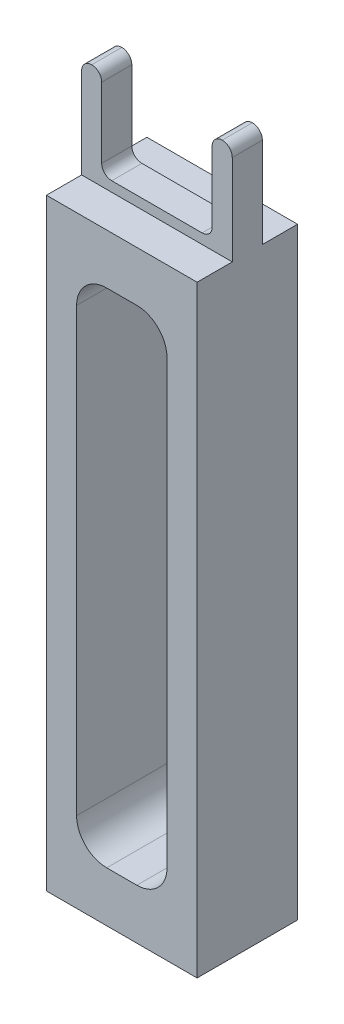
ISO-10303-21;
HEADER;
FILE_DESCRIPTION(('STEP AP214'),'2;1');
FILE_NAME('part.step','',(''),(''),'','','');
FILE_SCHEMA(('AUTOMOTIVE_DESIGN { 1 0 10303 214 1 1 1 1 }'));
ENDSEC;
DATA;
#1=APPLICATION_CONTEXT('core data for automotive mechanical design processes');
#2=APPLICATION_PROTOCOL_DEFINITION('international standard','automotive_design',2000,#1);
#3=PRODUCT_CONTEXT('',#1,'mechanical');
#4=PRODUCT('Part','Part','',(#3));
#5=PRODUCT_RELATED_PRODUCT_CATEGORY('part','',(#4));
#6=PRODUCT_DEFINITION_FORMATION('','',#4);
#7=PRODUCT_DEFINITION_CONTEXT('part definition',#1,'design');
#8=PRODUCT_DEFINITION('design','',#6,#7);
#9=PRODUCT_DEFINITION_SHAPE('','',#8);
#10=(LENGTH_UNIT() NAMED_UNIT(*) SI_UNIT(.MILLI.,.METRE.));
#11=(NAMED_UNIT(*) PLANE_ANGLE_UNIT() SI_UNIT($,.RADIAN.));
#12=(NAMED_UNIT(*) SI_UNIT($,.STERADIAN.) SOLID_ANGLE_UNIT());
#13=UNCERTAINTY_MEASURE_WITH_UNIT(LENGTH_MEASURE(1.E-05),#10,'distance_accuracy_value','');
#14=(GEOMETRIC_REPRESENTATION_CONTEXT(3) GLOBAL_UNCERTAINTY_ASSIGNED_CONTEXT((#13)) GLOBAL_UNIT_ASSIGNED_CONTEXT((#10,
#11,#12)) REPRESENTATION_CONTEXT('',''));
#15=CARTESIAN_POINT('',(0.,0.,0.));
#16=DIRECTION('',(0.,0.,1.));
#17=DIRECTION('',(1.,0.,0.));
#18=AXIS2_PLACEMENT_3D('',#15,#16,#17);
#19=CARTESIAN_POINT('',(0.,60.,0.));
#20=DIRECTION('',(0.,-1.,0.));
#21=DIRECTION('',(0.,0.,-1.));
#22=AXIS2_PLACEMENT_3D('',#19,#20,#21);
#23=PLANE('',#22);
#24=DIRECTION('',(1.,0.,0.));
#25=VECTOR('',#24,1.);
#26=CARTESIAN_POINT('',(-7.5,60.,1.5));
#27=LINE('',#26,#25);
#28=CARTESIAN_POINT('',(-7.5,60.,1.5));
#29=VERTEX_POINT('',#28);
#30=CARTESIAN_POINT('',(7.5,60.,1.5));
#31=VERTEX_POINT('',#30);
#32=EDGE_CURVE('E285',#29,#31,#27,.T.);
#33=ORIENTED_EDGE('',*,*,#32,.F.);
#34=DIRECTION('',(0.,0.,1.));
#35=VECTOR('',#34,1.);
#36=CARTESIAN_POINT('',(-7.5,60.,5.));
#37=LINE('',#36,#35);
#38=CARTESIAN_POINT('',(-7.5,60.,5.));
#39=VERTEX_POINT('',#38);
#40=EDGE_CURVE('E303',#29,#39,#37,.T.);
#41=ORIENTED_EDGE('',*,*,#40,.T.);
#42=DIRECTION('',(1.,0.,0.));
#43=VECTOR('',#42,1.);
#44=CARTESIAN_POINT('',(-7.5,60.,5.));
#45=LINE('',#44,#43);
#46=CARTESIAN_POINT('',(7.5,60.,5.));
#47=VERTEX_POINT('',#46);
#48=EDGE_CURVE('E307',#39,#47,#45,.T.);
#49=ORIENTED_EDGE('',*,*,#48,.T.);
#50=DIRECTION('',(0.,0.,-1.));
#51=VECTOR('',#50,1.);
#52=CARTESIAN_POINT('',(7.5,60.,5.));
#53=LINE('',#52,#51);
#54=EDGE_CURVE('E297',#47,#31,#53,.T.);
#55=ORIENTED_EDGE('',*,*,#54,.T.);
#56=EDGE_LOOP('',(#33,#41,#49,#55));
#57=FACE_BOUND('',#56,.T.);
#58=ADVANCED_FACE('F33',(#57),#23,.F.);
#59=DIRECTION('',(-1.,0.,0.));
#60=VECTOR('',#59,1.);
#61=CARTESIAN_POINT('',(-7.5,60.,-1.5));
#62=LINE('',#61,#60);
#63=CARTESIAN_POINT('',(7.5,60.,-1.5));
#64=VERTEX_POINT('',#63);
#65=CARTESIAN_POINT('',(-7.5,60.,-1.5));
#66=VERTEX_POINT('',#65);
#67=EDGE_CURVE('E282',#64,#66,#62,.T.);
#68=ORIENTED_EDGE('',*,*,#67,.F.);
#69=CARTESIAN_POINT('',(7.5,60.,-5.));
#70=VERTEX_POINT('',#69);
#71=EDGE_CURVE('E301',#64,#70,#53,.T.);
#72=ORIENTED_EDGE('',*,*,#71,.T.);
#73=DIRECTION('',(-1.,0.,0.));
#74=VECTOR('',#73,1.);
#75=CARTESIAN_POINT('',(-7.5,60.,-5.));
#76=LINE('',#75,#74);
#77=CARTESIAN_POINT('',(-7.5,60.,-5.));
#78=VERTEX_POINT('',#77);
#79=EDGE_CURVE('E300',#70,#78,#76,.T.);
#80=ORIENTED_EDGE('',*,*,#79,.T.);
#81=EDGE_CURVE('E304',#78,#66,#37,.T.);
#82=ORIENTED_EDGE('',*,*,#81,.T.);
#83=EDGE_LOOP('',(#68,#72,#80,#82));
#84=FACE_BOUND('',#83,.T.);
#85=ADVANCED_FACE('F427',(#84),#23,.F.);
#86=CARTESIAN_POINT('',(7.5,60.,5.));
#87=DIRECTION('',(-1.,0.,0.));
#88=DIRECTION('',(0.,0.,1.));
#89=AXIS2_PLACEMENT_3D('',#86,#87,#88);
#90=PLANE('',#89);
#91=DIRECTION('',(0.,-1.,0.));
#92=VECTOR('',#91,1.);
#93=CARTESIAN_POINT('',(7.5,70.,-1.5));
#94=LINE('',#93,#92);
#95=CARTESIAN_POINT('',(7.5,69.,-1.5));
#96=VERTEX_POINT('',#95);
#97=EDGE_CURVE('E294',#96,#64,#94,.T.);
#98=ORIENTED_EDGE('',*,*,#97,.F.);
#99=DIRECTION('',(0.,0.,-1.));
#100=VECTOR('',#99,1.);
#101=CARTESIAN_POINT('',(7.5,69.,5.));
#102=LINE('',#101,#100);
#103=CARTESIAN_POINT('',(7.5,69.,1.5));
#104=VERTEX_POINT('',#103);
#105=EDGE_CURVE('E362',#96,#104,#102,.F.);
#106=ORIENTED_EDGE('',*,*,#105,.T.);
#107=DIRECTION('',(0.,-1.,0.));
#108=VECTOR('',#107,1.);
#109=CARTESIAN_POINT('',(7.5,70.,1.5));
#110=LINE('',#109,#108);
#111=EDGE_CURVE('E288',#104,#31,#110,.T.);
#112=ORIENTED_EDGE('',*,*,#111,.T.);
#113=ORIENTED_EDGE('',*,*,#54,.F.);
#114=DIRECTION('',(0.,-1.,0.));
#115=VECTOR('',#114,1.);
#116=CARTESIAN_POINT('',(7.5,60.,5.));
#117=LINE('',#116,#115);
#118=CARTESIAN_POINT('',(7.5,0.,5.));
#119=VERTEX_POINT('',#118);
#120=EDGE_CURVE('E309',#47,#119,#117,.T.);
#121=ORIENTED_EDGE('',*,*,#120,.T.);
#122=DIRECTION('',(0.,0.,-1.));
#123=VECTOR('',#122,1.);
#124=CARTESIAN_POINT('',(7.5,0.,5.));
#125=LINE('',#124,#123);
#126=CARTESIAN_POINT('',(7.5,0.,-5.));
#127=VERTEX_POINT('',#126);
#128=EDGE_CURVE('E296',#119,#127,#125,.T.);
#129=ORIENTED_EDGE('',*,*,#128,.T.);
#130=DIRECTION('',(0.,-1.,0.));
#131=VECTOR('',#130,1.);
#132=CARTESIAN_POINT('',(7.5,60.,-5.));
#133=LINE('',#132,#131);
#134=EDGE_CURVE('E326',#70,#127,#133,.T.);
#135=ORIENTED_EDGE('',*,*,#134,.F.);
#136=ORIENTED_EDGE('',*,*,#71,.F.);
#137=EDGE_LOOP('',(#98,#106,#112,#113,#121,#129,#135,#136));
#138=FACE_BOUND('',#137,.T.);
#139=ADVANCED_FACE('F444',(#138),#90,.F.);
#140=CARTESIAN_POINT('',(-7.5,60.,-5.));
#141=DIRECTION('',(0.,0.,1.));
#142=DIRECTION('',(1.,0.,0.));
#143=AXIS2_PLACEMENT_3D('',#140,#141,#142);
#144=PLANE('',#143);
#145=DIRECTION('',(0.,-1.,0.));
#146=VECTOR('',#145,1.);
#147=CARTESIAN_POINT('',(-4.5,8.00000000000002,-5.));
#148=LINE('',#147,#146);
#149=CARTESIAN_POINT('',(-4.5,52.,-5.));
#150=VERTEX_POINT('',#149);
#151=CARTESIAN_POINT('',(-4.5,8.00000000000002,-5.));
#152=VERTEX_POINT('',#151);
#153=EDGE_CURVE('E203',#150,#152,#148,.T.);
#154=ORIENTED_EDGE('',*,*,#153,.T.);
#155=CARTESIAN_POINT('',(-1.5,8.,-5.));
#156=DIRECTION('',(0.,0.,1.));
#157=DIRECTION('',(-1.,0.,0.));
#158=AXIS2_PLACEMENT_3D('',#155,#156,#157);
#159=CIRCLE('',#158,3.);
#160=CARTESIAN_POINT('',(-1.49999999999998,5.,-5.));
#161=VERTEX_POINT('',#160);
#162=EDGE_CURVE('E197',#152,#161,#159,.T.);
#163=ORIENTED_EDGE('',*,*,#162,.T.);
#164=DIRECTION('',(1.,0.,0.));
#165=VECTOR('',#164,1.);
#166=CARTESIAN_POINT('',(-1.49999999999998,5.,-5.));
#167=LINE('',#166,#165);
#168=CARTESIAN_POINT('',(1.49999999999998,5.,-5.));
#169=VERTEX_POINT('',#168);
#170=EDGE_CURVE('E206',#161,#169,#167,.T.);
#171=ORIENTED_EDGE('',*,*,#170,.T.);
#172=CARTESIAN_POINT('',(1.5,8.,-5.));
#173=DIRECTION('',(0.,0.,1.));
#174=DIRECTION('',(1.,0.,0.));
#175=AXIS2_PLACEMENT_3D('',#172,#173,#174);
#176=CIRCLE('',#175,3.);
#177=CARTESIAN_POINT('',(4.5,8.,-5.));
#178=VERTEX_POINT('',#177);
#179=EDGE_CURVE('E50',#169,#178,#176,.T.);
#180=ORIENTED_EDGE('',*,*,#179,.T.);
#181=DIRECTION('',(0.,1.,0.));
#182=VECTOR('',#181,1.);
#183=CARTESIAN_POINT('',(4.5,8.00000000000002,-5.));
#184=LINE('',#183,#182);
#185=CARTESIAN_POINT('',(4.5,52.,-5.));
#186=VERTEX_POINT('',#185);
#187=EDGE_CURVE('E221',#178,#186,#184,.T.);
#188=ORIENTED_EDGE('',*,*,#187,.T.);
#189=CARTESIAN_POINT('',(1.5,52.,-5.));
#190=DIRECTION('',(0.,0.,1.));
#191=DIRECTION('',(-1.,0.,0.));
#192=AXIS2_PLACEMENT_3D('',#189,#190,#191);
#193=CIRCLE('',#192,3.);
#194=CARTESIAN_POINT('',(1.49999999999998,55.,-5.));
#195=VERTEX_POINT('',#194);
#196=EDGE_CURVE('E224',#186,#195,#193,.T.);
#197=ORIENTED_EDGE('',*,*,#196,.T.);
#198=DIRECTION('',(-1.,0.,0.));
#199=VECTOR('',#198,1.);
#200=CARTESIAN_POINT('',(-1.49999999999998,55.,-5.));
#201=LINE('',#200,#199);
#202=CARTESIAN_POINT('',(-1.49999999999998,55.,-5.));
#203=VERTEX_POINT('',#202);
#204=EDGE_CURVE('E227',#195,#203,#201,.T.);
#205=ORIENTED_EDGE('',*,*,#204,.T.);
#206=CARTESIAN_POINT('',(-1.5,52.,-5.));
#207=DIRECTION('',(0.,0.,1.));
#208=DIRECTION('',(-1.,0.,0.));
#209=AXIS2_PLACEMENT_3D('',#206,#207,#208);
#210=CIRCLE('',#209,3.);
#211=EDGE_CURVE('E230',#203,#150,#210,.T.);
#212=ORIENTED_EDGE('',*,*,#211,.T.);
#213=EDGE_LOOP('',(#154,#163,#171,#180,#188,#197,#205,#212));
#214=FACE_BOUND('',#213,.T.);
#215=DIRECTION('',(-1.,0.,0.));
#216=VECTOR('',#215,1.);
#217=CARTESIAN_POINT('',(-7.5,0.,-5.));
#218=LINE('',#217,#216);
#219=CARTESIAN_POINT('',(-7.5,0.,-5.));
#220=VERTEX_POINT('',#219);
#221=EDGE_CURVE('E312',#127,#220,#218,.T.);
#222=ORIENTED_EDGE('',*,*,#221,.T.);
#223=DIRECTION('',(0.,-1.,0.));
#224=VECTOR('',#223,1.);
#225=CARTESIAN_POINT('',(-7.5,60.,-5.));
#226=LINE('',#225,#224);
#227=EDGE_CURVE('E323',#78,#220,#226,.T.);
#228=ORIENTED_EDGE('',*,*,#227,.F.);
#229=ORIENTED_EDGE('',*,*,#79,.F.);
#230=ORIENTED_EDGE('',*,*,#134,.T.);
#231=EDGE_LOOP('',(#222,#228,#229,#230));
#232=FACE_BOUND('',#231,.T.);
#233=ADVANCED_FACE('F210',(#214,#232),#144,.F.);
#234=CARTESIAN_POINT('',(-7.5,60.,5.));
#235=DIRECTION('',(1.,0.,0.));
#236=DIRECTION('',(0.,0.,-1.));
#237=AXIS2_PLACEMENT_3D('',#234,#235,#236);
#238=PLANE('',#237);
#239=DIRECTION('',(0.,-1.,0.));
#240=VECTOR('',#239,1.);
#241=CARTESIAN_POINT('',(-7.5,70.,1.5));
#242=LINE('',#241,#240);
#243=CARTESIAN_POINT('',(-7.5,69.,1.5));
#244=VERTEX_POINT('',#243);
#245=EDGE_CURVE('E290',#244,#29,#242,.T.);
#246=ORIENTED_EDGE('',*,*,#245,.F.);
#247=DIRECTION('',(0.,0.,1.));
#248=VECTOR('',#247,1.);
#249=CARTESIAN_POINT('',(-7.5,69.,5.));
#250=LINE('',#249,#248);
#251=CARTESIAN_POINT('',(-7.5,69.,-1.5));
#252=VERTEX_POINT('',#251);
#253=EDGE_CURVE('E351',#244,#252,#250,.F.);
#254=ORIENTED_EDGE('',*,*,#253,.T.);
#255=DIRECTION('',(0.,-1.,0.));
#256=VECTOR('',#255,1.);
#257=CARTESIAN_POINT('',(-7.5,70.,-1.5));
#258=LINE('',#257,#256);
#259=EDGE_CURVE('E292',#252,#66,#258,.T.);
#260=ORIENTED_EDGE('',*,*,#259,.T.);
#261=ORIENTED_EDGE('',*,*,#81,.F.);
#262=ORIENTED_EDGE('',*,*,#227,.T.);
#263=DIRECTION('',(0.,0.,1.));
#264=VECTOR('',#263,1.);
#265=CARTESIAN_POINT('',(-7.5,0.,5.));
#266=LINE('',#265,#264);
#267=CARTESIAN_POINT('',(-7.5,0.,5.));
#268=VERTEX_POINT('',#267);
#269=EDGE_CURVE('E314',#220,#268,#266,.T.);
#270=ORIENTED_EDGE('',*,*,#269,.T.);
#271=DIRECTION('',(0.,-1.,0.));
#272=VECTOR('',#271,1.);
#273=CARTESIAN_POINT('',(-7.5,60.,5.));
#274=LINE('',#273,#272);
#275=EDGE_CURVE('E320',#39,#268,#274,.T.);
#276=ORIENTED_EDGE('',*,*,#275,.F.);
#277=ORIENTED_EDGE('',*,*,#40,.F.);
#278=EDGE_LOOP('',(#246,#254,#260,#261,#262,#270,#276,#277));
#279=FACE_BOUND('',#278,.T.);
#280=ADVANCED_FACE('F418',(#279),#238,.F.);
#281=CARTESIAN_POINT('',(-7.5,60.,5.));
#282=DIRECTION('',(0.,0.,-1.));
#283=DIRECTION('',(-1.,0.,0.));
#284=AXIS2_PLACEMENT_3D('',#281,#282,#283);
#285=PLANE('',#284);
#286=DIRECTION('',(1.,0.,0.));
#287=VECTOR('',#286,1.);
#288=CARTESIAN_POINT('',(-1.49999999999998,5.,5.));
#289=LINE('',#288,#287);
#290=CARTESIAN_POINT('',(-1.49999999999998,5.,5.));
#291=VERTEX_POINT('',#290);
#292=CARTESIAN_POINT('',(1.49999999999998,5.,5.));
#293=VERTEX_POINT('',#292);
#294=EDGE_CURVE('E234',#291,#293,#289,.T.);
#295=ORIENTED_EDGE('',*,*,#294,.F.);
#296=CARTESIAN_POINT('',(-1.5,8.,5.));
#297=DIRECTION('',(0.,0.,1.));
#298=DIRECTION('',(-1.,0.,0.));
#299=AXIS2_PLACEMENT_3D('',#296,#297,#298);
#300=CIRCLE('',#299,3.);
#301=CARTESIAN_POINT('',(-4.5,8.00000000000002,5.));
#302=VERTEX_POINT('',#301);
#303=EDGE_CURVE('E58',#302,#291,#300,.T.);
#304=ORIENTED_EDGE('',*,*,#303,.F.);
#305=DIRECTION('',(0.,-1.,0.));
#306=VECTOR('',#305,1.);
#307=CARTESIAN_POINT('',(-4.5,8.00000000000002,5.));
#308=LINE('',#307,#306);
#309=CARTESIAN_POINT('',(-4.5,52.,5.));
#310=VERTEX_POINT('',#309);
#311=EDGE_CURVE('E214',#310,#302,#308,.T.);
#312=ORIENTED_EDGE('',*,*,#311,.F.);
#313=CARTESIAN_POINT('',(-1.5,52.,5.));
#314=DIRECTION('',(0.,0.,1.));
#315=DIRECTION('',(-1.,0.,0.));
#316=AXIS2_PLACEMENT_3D('',#313,#314,#315);
#317=CIRCLE('',#316,3.);
#318=CARTESIAN_POINT('',(-1.49999999999998,55.,5.));
#319=VERTEX_POINT('',#318);
#320=EDGE_CURVE('E217',#319,#310,#317,.T.);
#321=ORIENTED_EDGE('',*,*,#320,.F.);
#322=DIRECTION('',(-1.,0.,0.));
#323=VECTOR('',#322,1.);
#324=CARTESIAN_POINT('',(-1.49999999999998,55.,5.));
#325=LINE('',#324,#323);
#326=CARTESIAN_POINT('',(1.49999999999998,55.,5.));
#327=VERTEX_POINT('',#326);
#328=EDGE_CURVE('E245',#327,#319,#325,.T.);
#329=ORIENTED_EDGE('',*,*,#328,.F.);
#330=CARTESIAN_POINT('',(1.5,52.,5.));
#331=DIRECTION('',(0.,0.,1.));
#332=DIRECTION('',(-1.,0.,0.));
#333=AXIS2_PLACEMENT_3D('',#330,#331,#332);
#334=CIRCLE('',#333,3.);
#335=CARTESIAN_POINT('',(4.5,52.,5.));
#336=VERTEX_POINT('',#335);
#337=EDGE_CURVE('E242',#336,#327,#334,.T.);
#338=ORIENTED_EDGE('',*,*,#337,.F.);
#339=DIRECTION('',(0.,1.,0.));
#340=VECTOR('',#339,1.);
#341=CARTESIAN_POINT('',(4.5,8.00000000000002,5.));
#342=LINE('',#341,#340);
#343=CARTESIAN_POINT('',(4.5,8.,5.));
#344=VERTEX_POINT('',#343);
#345=EDGE_CURVE('E239',#344,#336,#342,.T.);
#346=ORIENTED_EDGE('',*,*,#345,.F.);
#347=CARTESIAN_POINT('',(1.5,8.,5.));
#348=DIRECTION('',(0.,0.,1.));
#349=DIRECTION('',(1.,0.,0.));
#350=AXIS2_PLACEMENT_3D('',#347,#348,#349);
#351=CIRCLE('',#350,3.);
#352=EDGE_CURVE('E236',#293,#344,#351,.T.);
#353=ORIENTED_EDGE('',*,*,#352,.F.);
#354=EDGE_LOOP('',(#295,#304,#312,#321,#329,#338,#346,#353));
#355=FACE_BOUND('',#354,.T.);
#356=DIRECTION('',(1.,0.,0.));
#357=VECTOR('',#356,1.);
#358=CARTESIAN_POINT('',(-7.5,0.,5.));
#359=LINE('',#358,#357);
#360=EDGE_CURVE('E316',#268,#119,#359,.T.);
#361=ORIENTED_EDGE('',*,*,#360,.T.);
#362=ORIENTED_EDGE('',*,*,#120,.F.);
#363=ORIENTED_EDGE('',*,*,#48,.F.);
#364=ORIENTED_EDGE('',*,*,#275,.T.);
#365=EDGE_LOOP('',(#361,#362,#363,#364));
#366=FACE_BOUND('',#365,.T.);
#367=ADVANCED_FACE('F439',(#355,#366),#285,.F.);
#368=CARTESIAN_POINT('',(0.,0.,0.));
#369=DIRECTION('',(0.,-1.,0.));
#370=DIRECTION('',(0.,0.,-1.));
#371=AXIS2_PLACEMENT_3D('',#368,#369,#370);
#372=PLANE('',#371);
#373=ORIENTED_EDGE('',*,*,#128,.F.);
#374=ORIENTED_EDGE('',*,*,#360,.F.);
#375=ORIENTED_EDGE('',*,*,#269,.F.);
#376=ORIENTED_EDGE('',*,*,#221,.F.);
#377=EDGE_LOOP('',(#373,#374,#375,#376));
#378=FACE_BOUND('',#377,.T.);
#379=ADVANCED_FACE('F436',(#378),#372,.T.);
#380=CARTESIAN_POINT('',(-7.5,70.,-1.5));
#381=DIRECTION('',(0.,0.,1.));
#382=DIRECTION('',(1.,0.,0.));
#383=AXIS2_PLACEMENT_3D('',#380,#381,#382);
#384=PLANE('',#383);
#385=ORIENTED_EDGE('',*,*,#259,.F.);
#386=CARTESIAN_POINT('',(-6.5,69.,-1.5));
#387=DIRECTION('',(0.,0.,1.));
#388=DIRECTION('',(1.,0.,0.));
#389=AXIS2_PLACEMENT_3D('',#386,#387,#388);
#390=CIRCLE('',#389,1.);
#391=CARTESIAN_POINT('',(-6.5,70.,-1.5));
#392=VERTEX_POINT('',#391);
#393=EDGE_CURVE('E360',#252,#392,#390,.F.);
#394=ORIENTED_EDGE('',*,*,#393,.T.);
#395=CARTESIAN_POINT('',(-6.5,69.,-1.5));
#396=DIRECTION('',(0.,0.,1.));
#397=DIRECTION('',(1.,0.,0.));
#398=AXIS2_PLACEMENT_3D('',#395,#396,#397);
#399=CIRCLE('',#398,1.);
#400=CARTESIAN_POINT('',(-5.5,69.,-1.5));
#401=VERTEX_POINT('',#400);
#402=EDGE_CURVE('E358',#392,#401,#399,.F.);
#403=ORIENTED_EDGE('',*,*,#402,.T.);
#404=DIRECTION('',(0.,-1.,0.));
#405=VECTOR('',#404,1.);
#406=CARTESIAN_POINT('',(-5.5,70.,-1.5));
#407=LINE('',#406,#405);
#408=CARTESIAN_POINT('',(-5.5,62.,-1.5));
#409=VERTEX_POINT('',#408);
#410=EDGE_CURVE('E273',#401,#409,#407,.T.);
#411=ORIENTED_EDGE('',*,*,#410,.T.);
#412=CARTESIAN_POINT('',(-4.5,62.,-1.5));
#413=DIRECTION('',(0.,0.,1.));
#414=DIRECTION('',(1.,0.,0.));
#415=AXIS2_PLACEMENT_3D('',#412,#413,#414);
#416=CIRCLE('',#415,1.);
#417=CARTESIAN_POINT('',(-4.5,61.,-1.5));
#418=VERTEX_POINT('',#417);
#419=EDGE_CURVE('E11',#409,#418,#416,.T.);
#420=ORIENTED_EDGE('',*,*,#419,.T.);
#421=DIRECTION('',(1.,0.,0.));
#422=VECTOR('',#421,1.);
#423=CARTESIAN_POINT('',(-7.5,61.,-1.5));
#424=LINE('',#423,#422);
#425=CARTESIAN_POINT('',(4.5,61.,-1.5));
#426=VERTEX_POINT('',#425);
#427=EDGE_CURVE('E279',#418,#426,#424,.T.);
#428=ORIENTED_EDGE('',*,*,#427,.T.);
#429=CARTESIAN_POINT('',(4.5,62.,-1.5));
#430=DIRECTION('',(0.,0.,1.));
#431=DIRECTION('',(1.,0.,0.));
#432=AXIS2_PLACEMENT_3D('',#429,#430,#431);
#433=CIRCLE('',#432,1.);
#434=CARTESIAN_POINT('',(5.5,62.,-1.5));
#435=VERTEX_POINT('',#434);
#436=EDGE_CURVE('E367',#426,#435,#433,.T.);
#437=ORIENTED_EDGE('',*,*,#436,.T.);
#438=DIRECTION('',(0.,1.,0.));
#439=VECTOR('',#438,1.);
#440=CARTESIAN_POINT('',(5.5,70.,-1.5));
#441=LINE('',#440,#439);
#442=CARTESIAN_POINT('',(5.5,69.,-1.5));
#443=VERTEX_POINT('',#442);
#444=EDGE_CURVE('E276',#435,#443,#441,.T.);
#445=ORIENTED_EDGE('',*,*,#444,.T.);
#446=CARTESIAN_POINT('',(6.5,69.,-1.5));
#447=DIRECTION('',(0.,0.,1.));
#448=DIRECTION('',(1.,0.,0.));
#449=AXIS2_PLACEMENT_3D('',#446,#447,#448);
#450=CIRCLE('',#449,1.);
#451=CARTESIAN_POINT('',(6.5,70.,-1.5));
#452=VERTEX_POINT('',#451);
#453=EDGE_CURVE('E354',#443,#452,#450,.F.);
#454=ORIENTED_EDGE('',*,*,#453,.T.);
#455=CARTESIAN_POINT('',(6.5,69.,-1.5));
#456=DIRECTION('',(0.,0.,1.));
#457=DIRECTION('',(1.,0.,0.));
#458=AXIS2_PLACEMENT_3D('',#455,#456,#457);
#459=CIRCLE('',#458,1.);
#460=EDGE_CURVE('E356',#452,#96,#459,.F.);
#461=ORIENTED_EDGE('',*,*,#460,.T.);
#462=ORIENTED_EDGE('',*,*,#97,.T.);
#463=ORIENTED_EDGE('',*,*,#67,.T.);
#464=EDGE_LOOP('',(#385,#394,#403,#411,#420,#428,#437,#445,#454,#461,#462,#463));
#465=FACE_BOUND('',#464,.T.);
#466=ADVANCED_FACE('F423',(#465),#384,.F.);
#467=CARTESIAN_POINT('',(-7.5,70.,1.5));
#468=DIRECTION('',(0.,0.,-1.));
#469=DIRECTION('',(-1.,0.,0.));
#470=AXIS2_PLACEMENT_3D('',#467,#468,#469);
#471=PLANE('',#470);
#472=CARTESIAN_POINT('',(-6.5,69.,1.5));
#473=DIRECTION('',(0.,0.,-1.));
#474=DIRECTION('',(-1.,0.,0.));
#475=AXIS2_PLACEMENT_3D('',#472,#473,#474);
#476=CIRCLE('',#475,1.);
#477=CARTESIAN_POINT('',(-5.5,69.,1.5));
#478=VERTEX_POINT('',#477);
#479=CARTESIAN_POINT('',(-6.5,70.,1.5));
#480=VERTEX_POINT('',#479);
#481=EDGE_CURVE('E347',#478,#480,#476,.F.);
#482=ORIENTED_EDGE('',*,*,#481,.T.);
#483=CARTESIAN_POINT('',(-6.5,69.,1.5));
#484=DIRECTION('',(0.,0.,-1.));
#485=DIRECTION('',(-1.,0.,0.));
#486=AXIS2_PLACEMENT_3D('',#483,#484,#485);
#487=CIRCLE('',#486,1.);
#488=EDGE_CURVE('E349',#480,#244,#487,.F.);
#489=ORIENTED_EDGE('',*,*,#488,.T.);
#490=ORIENTED_EDGE('',*,*,#245,.T.);
#491=ORIENTED_EDGE('',*,*,#32,.T.);
#492=ORIENTED_EDGE('',*,*,#111,.F.);
#493=CARTESIAN_POINT('',(6.5,69.,1.5));
#494=DIRECTION('',(0.,0.,-1.));
#495=DIRECTION('',(-1.,0.,0.));
#496=AXIS2_PLACEMENT_3D('',#493,#494,#495);
#497=CIRCLE('',#496,1.);
#498=CARTESIAN_POINT('',(6.5,70.,1.5));
#499=VERTEX_POINT('',#498);
#500=EDGE_CURVE('E345',#104,#499,#497,.F.);
#501=ORIENTED_EDGE('',*,*,#500,.T.);
#502=CARTESIAN_POINT('',(6.5,69.,1.5));
#503=DIRECTION('',(0.,0.,-1.));
#504=DIRECTION('',(-1.,0.,0.));
#505=AXIS2_PLACEMENT_3D('',#502,#503,#504);
#506=CIRCLE('',#505,1.);
#507=CARTESIAN_POINT('',(5.5,69.,1.5));
#508=VERTEX_POINT('',#507);
#509=EDGE_CURVE('E343',#499,#508,#506,.F.);
#510=ORIENTED_EDGE('',*,*,#509,.T.);
#511=DIRECTION('',(0.,1.,0.));
#512=VECTOR('',#511,1.);
#513=CARTESIAN_POINT('',(5.5,61.,1.5));
#514=LINE('',#513,#512);
#515=CARTESIAN_POINT('',(5.5,62.,1.5));
#516=VERTEX_POINT('',#515);
#517=EDGE_CURVE('E263',#516,#508,#514,.T.);
#518=ORIENTED_EDGE('',*,*,#517,.F.);
#519=CARTESIAN_POINT('',(4.5,62.,1.5));
#520=DIRECTION('',(0.,0.,-1.));
#521=DIRECTION('',(-1.,0.,0.));
#522=AXIS2_PLACEMENT_3D('',#519,#520,#521);
#523=CIRCLE('',#522,1.);
#524=CARTESIAN_POINT('',(4.5,61.,1.5));
#525=VERTEX_POINT('',#524);
#526=EDGE_CURVE('E365',#516,#525,#523,.T.);
#527=ORIENTED_EDGE('',*,*,#526,.T.);
#528=DIRECTION('',(1.,0.,0.));
#529=VECTOR('',#528,1.);
#530=CARTESIAN_POINT('',(-5.5,61.,1.5));
#531=LINE('',#530,#529);
#532=CARTESIAN_POINT('',(-4.5,61.,1.5));
#533=VERTEX_POINT('',#532);
#534=EDGE_CURVE('E270',#533,#525,#531,.T.);
#535=ORIENTED_EDGE('',*,*,#534,.F.);
#536=CARTESIAN_POINT('',(-4.5,62.,1.5));
#537=DIRECTION('',(0.,0.,-1.));
#538=DIRECTION('',(-1.,0.,0.));
#539=AXIS2_PLACEMENT_3D('',#536,#537,#538);
#540=CIRCLE('',#539,1.);
#541=CARTESIAN_POINT('',(-5.5,62.,1.5));
#542=VERTEX_POINT('',#541);
#543=EDGE_CURVE('E42',#533,#542,#540,.T.);
#544=ORIENTED_EDGE('',*,*,#543,.T.);
#545=DIRECTION('',(0.,-1.,0.));
#546=VECTOR('',#545,1.);
#547=CARTESIAN_POINT('',(-5.5,61.,1.5));
#548=LINE('',#547,#546);
#549=EDGE_CURVE('E266',#478,#542,#548,.T.);
#550=ORIENTED_EDGE('',*,*,#549,.F.);
#551=EDGE_LOOP('',(#482,#489,#490,#491,#492,#501,#510,#518,#527,#535,#544,#550));
#552=FACE_BOUND('',#551,.T.);
#553=ADVANCED_FACE('F385',(#552),#471,.F.);
#554=CARTESIAN_POINT('',(-5.5,61.,-5.));
#555=DIRECTION('',(0.,-1.,0.));
#556=DIRECTION('',(0.,0.,-1.));
#557=AXIS2_PLACEMENT_3D('',#554,#555,#556);
#558=PLANE('',#557);
#559=ORIENTED_EDGE('',*,*,#534,.T.);
#560=DIRECTION('',(0.,0.,1.));
#561=VECTOR('',#560,1.);
#562=CARTESIAN_POINT('',(4.5,61.,-1.5));
#563=LINE('',#562,#561);
#564=EDGE_CURVE('E337',#525,#426,#563,.F.);
#565=ORIENTED_EDGE('',*,*,#564,.T.);
#566=ORIENTED_EDGE('',*,*,#427,.F.);
#567=DIRECTION('',(0.,0.,1.));
#568=VECTOR('',#567,1.);
#569=CARTESIAN_POINT('',(-4.5,61.,1.5));
#570=LINE('',#569,#568);
#571=EDGE_CURVE('E334',#418,#533,#570,.T.);
#572=ORIENTED_EDGE('',*,*,#571,.T.);
#573=EDGE_LOOP('',(#559,#565,#566,#572));
#574=FACE_BOUND('',#573,.T.);
#575=ADVANCED_FACE('F397',(#574),#558,.F.);
#576=CARTESIAN_POINT('',(5.5,61.,-5.));
#577=DIRECTION('',(1.,0.,0.));
#578=DIRECTION('',(0.,0.,-1.));
#579=AXIS2_PLACEMENT_3D('',#576,#577,#578);
#580=PLANE('',#579);
#581=ORIENTED_EDGE('',*,*,#444,.F.);
#582=DIRECTION('',(0.,0.,1.));
#583=VECTOR('',#582,1.);
#584=CARTESIAN_POINT('',(5.5,62.,1.5));
#585=LINE('',#584,#583);
#586=EDGE_CURVE('E331',#435,#516,#585,.T.);
#587=ORIENTED_EDGE('',*,*,#586,.T.);
#588=ORIENTED_EDGE('',*,*,#517,.T.);
#589=DIRECTION('',(0.,0.,1.));
#590=VECTOR('',#589,1.);
#591=CARTESIAN_POINT('',(5.5,69.,-5.));
#592=LINE('',#591,#590);
#593=EDGE_CURVE('E329',#508,#443,#592,.F.);
#594=ORIENTED_EDGE('',*,*,#593,.T.);
#595=EDGE_LOOP('',(#581,#587,#588,#594));
#596=FACE_BOUND('',#595,.T.);
#597=ADVANCED_FACE('F389',(#596),#580,.F.);
#598=CARTESIAN_POINT('',(-5.5,61.,-5.));
#599=DIRECTION('',(-1.,0.,0.));
#600=DIRECTION('',(0.,0.,1.));
#601=AXIS2_PLACEMENT_3D('',#598,#599,#600);
#602=PLANE('',#601);
#603=ORIENTED_EDGE('',*,*,#549,.T.);
#604=DIRECTION('',(0.,0.,1.));
#605=VECTOR('',#604,1.);
#606=CARTESIAN_POINT('',(-5.5,62.,-1.5));
#607=LINE('',#606,#605);
#608=EDGE_CURVE('E341',#542,#409,#607,.F.);
#609=ORIENTED_EDGE('',*,*,#608,.T.);
#610=ORIENTED_EDGE('',*,*,#410,.F.);
#611=DIRECTION('',(0.,0.,-1.));
#612=VECTOR('',#611,1.);
#613=CARTESIAN_POINT('',(-5.5,69.,-5.));
#614=LINE('',#613,#612);
#615=EDGE_CURVE('E339',#401,#478,#614,.F.);
#616=ORIENTED_EDGE('',*,*,#615,.T.);
#617=EDGE_LOOP('',(#603,#609,#610,#616));
#618=FACE_BOUND('',#617,.T.);
#619=ADVANCED_FACE('F407',(#618),#602,.F.);
#620=CARTESIAN_POINT('',(4.5,62.,-5.));
#621=DIRECTION('',(0.,0.,-1.));
#622=DIRECTION('',(-1.,0.,0.));
#623=AXIS2_PLACEMENT_3D('',#620,#621,#622);
#624=CYLINDRICAL_SURFACE('',#623,1.);
#625=ORIENTED_EDGE('',*,*,#436,.F.);
#626=ORIENTED_EDGE('',*,*,#564,.F.);
#627=ORIENTED_EDGE('',*,*,#526,.F.);
#628=ORIENTED_EDGE('',*,*,#586,.F.);
#629=EDGE_LOOP('',(#625,#626,#627,#628));
#630=FACE_BOUND('',#629,.T.);
#631=ADVANCED_FACE('F393',(#630),#624,.F.);
#632=CARTESIAN_POINT('',(-4.5,62.,-5.));
#633=DIRECTION('',(0.,0.,-1.));
#634=DIRECTION('',(-1.,0.,0.));
#635=AXIS2_PLACEMENT_3D('',#632,#633,#634);
#636=CYLINDRICAL_SURFACE('',#635,1.);
#637=ORIENTED_EDGE('',*,*,#419,.F.);
#638=ORIENTED_EDGE('',*,*,#608,.F.);
#639=ORIENTED_EDGE('',*,*,#543,.F.);
#640=ORIENTED_EDGE('',*,*,#571,.F.);
#641=EDGE_LOOP('',(#637,#638,#639,#640));
#642=FACE_BOUND('',#641,.T.);
#643=ADVANCED_FACE('F402',(#642),#636,.F.);
#644=CARTESIAN_POINT('',(-6.5,69.,0.));
#645=DIRECTION('',(0.,0.,-1.));
#646=DIRECTION('',(-1.,0.,0.));
#647=AXIS2_PLACEMENT_3D('',#644,#645,#646);
#648=CYLINDRICAL_SURFACE('',#647,1.);
#649=ORIENTED_EDGE('',*,*,#615,.F.);
#650=ORIENTED_EDGE('',*,*,#402,.F.);
#651=DIRECTION('',(0.,0.,-1.));
#652=VECTOR('',#651,1.);
#653=CARTESIAN_POINT('',(-6.5,70.,0.));
#654=LINE('',#653,#652);
#655=EDGE_CURVE('E267',#480,#392,#654,.T.);
#656=ORIENTED_EDGE('',*,*,#655,.F.);
#657=ORIENTED_EDGE('',*,*,#481,.F.);
#658=EDGE_LOOP('',(#649,#650,#656,#657));
#659=FACE_BOUND('',#658,.T.);
#660=ADVANCED_FACE('F412',(#659),#648,.T.);
#661=CARTESIAN_POINT('',(-6.5,69.,0.));
#662=DIRECTION('',(0.,0.,1.));
#663=DIRECTION('',(1.,0.,0.));
#664=AXIS2_PLACEMENT_3D('',#661,#662,#663);
#665=CYLINDRICAL_SURFACE('',#664,1.);
#666=ORIENTED_EDGE('',*,*,#393,.F.);
#667=ORIENTED_EDGE('',*,*,#253,.F.);
#668=ORIENTED_EDGE('',*,*,#488,.F.);
#669=ORIENTED_EDGE('',*,*,#655,.T.);
#670=EDGE_LOOP('',(#666,#667,#668,#669));
#671=FACE_BOUND('',#670,.T.);
#672=ADVANCED_FACE('F421',(#671),#665,.T.);
#673=CARTESIAN_POINT('',(6.5,69.,0.));
#674=DIRECTION('',(0.,0.,1.));
#675=DIRECTION('',(1.,0.,0.));
#676=AXIS2_PLACEMENT_3D('',#673,#674,#675);
#677=CYLINDRICAL_SURFACE('',#676,1.);
#678=ORIENTED_EDGE('',*,*,#593,.F.);
#679=ORIENTED_EDGE('',*,*,#509,.F.);
#680=DIRECTION('',(0.,0.,1.));
#681=VECTOR('',#680,1.);
#682=CARTESIAN_POINT('',(6.5,70.,0.));
#683=LINE('',#682,#681);
#684=EDGE_CURVE('E37',#452,#499,#683,.T.);
#685=ORIENTED_EDGE('',*,*,#684,.F.);
#686=ORIENTED_EDGE('',*,*,#453,.F.);
#687=EDGE_LOOP('',(#678,#679,#685,#686));
#688=FACE_BOUND('',#687,.T.);
#689=ADVANCED_FACE('F35',(#688),#677,.T.);
#690=CARTESIAN_POINT('',(6.5,69.,0.));
#691=DIRECTION('',(0.,0.,-1.));
#692=DIRECTION('',(-1.,0.,0.));
#693=AXIS2_PLACEMENT_3D('',#690,#691,#692);
#694=CYLINDRICAL_SURFACE('',#693,1.);
#695=ORIENTED_EDGE('',*,*,#500,.F.);
#696=ORIENTED_EDGE('',*,*,#105,.F.);
#697=ORIENTED_EDGE('',*,*,#460,.F.);
#698=ORIENTED_EDGE('',*,*,#684,.T.);
#699=EDGE_LOOP('',(#695,#696,#697,#698));
#700=FACE_BOUND('',#699,.T.);
#701=ADVANCED_FACE('F377',(#700),#694,.T.);
#702=CARTESIAN_POINT('',(-1.5,8.,-5.));
#703=DIRECTION('',(0.,0.,1.));
#704=DIRECTION('',(1.,0.,0.));
#705=AXIS2_PLACEMENT_3D('',#702,#703,#704);
#706=CYLINDRICAL_SURFACE('',#705,3.);
#707=ORIENTED_EDGE('',*,*,#303,.T.);
#708=DIRECTION('',(0.,0.,1.));
#709=VECTOR('',#708,1.);
#710=CARTESIAN_POINT('',(-1.49999999999998,5.,-5.));
#711=LINE('',#710,#709);
#712=EDGE_CURVE('E193',#161,#291,#711,.T.);
#713=ORIENTED_EDGE('',*,*,#712,.F.);
#714=ORIENTED_EDGE('',*,*,#162,.F.);
#715=DIRECTION('',(0.,0.,1.));
#716=VECTOR('',#715,1.);
#717=CARTESIAN_POINT('',(-4.5,8.00000000000002,-5.));
#718=LINE('',#717,#716);
#719=EDGE_CURVE('E250',#152,#302,#718,.T.);
#720=ORIENTED_EDGE('',*,*,#719,.T.);
#721=EDGE_LOOP('',(#707,#713,#714,#720));
#722=FACE_BOUND('',#721,.T.);
#723=ADVANCED_FACE('F195',(#722),#706,.F.);
#724=CARTESIAN_POINT('',(-4.5,8.00000000000002,-5.));
#725=DIRECTION('',(-1.,0.,0.));
#726=DIRECTION('',(0.,0.,1.));
#727=AXIS2_PLACEMENT_3D('',#724,#725,#726);
#728=PLANE('',#727);
#729=ORIENTED_EDGE('',*,*,#311,.T.);
#730=ORIENTED_EDGE('',*,*,#719,.F.);
#731=ORIENTED_EDGE('',*,*,#153,.F.);
#732=DIRECTION('',(0.,0.,1.));
#733=VECTOR('',#732,1.);
#734=CARTESIAN_POINT('',(-4.5,52.,-5.));
#735=LINE('',#734,#733);
#736=EDGE_CURVE('E252',#150,#310,#735,.T.);
#737=ORIENTED_EDGE('',*,*,#736,.T.);
#738=EDGE_LOOP('',(#729,#730,#731,#737));
#739=FACE_BOUND('',#738,.T.);
#740=ADVANCED_FACE('F477',(#739),#728,.F.);
#741=CARTESIAN_POINT('',(-1.5,52.,-5.));
#742=DIRECTION('',(0.,0.,1.));
#743=DIRECTION('',(1.,0.,0.));
#744=AXIS2_PLACEMENT_3D('',#741,#742,#743);
#745=CYLINDRICAL_SURFACE('',#744,3.);
#746=ORIENTED_EDGE('',*,*,#320,.T.);
#747=ORIENTED_EDGE('',*,*,#736,.F.);
#748=ORIENTED_EDGE('',*,*,#211,.F.);
#749=DIRECTION('',(0.,0.,1.));
#750=VECTOR('',#749,1.);
#751=CARTESIAN_POINT('',(-1.49999999999998,55.,-5.));
#752=LINE('',#751,#750);
#753=EDGE_CURVE('E254',#203,#319,#752,.T.);
#754=ORIENTED_EDGE('',*,*,#753,.T.);
#755=EDGE_LOOP('',(#746,#747,#748,#754));
#756=FACE_BOUND('',#755,.T.);
#757=ADVANCED_FACE('F606',(#756),#745,.F.);
#758=CARTESIAN_POINT('',(-1.49999999999998,55.,-5.));
#759=DIRECTION('',(0.,1.,0.));
#760=DIRECTION('',(0.,0.,1.));
#761=AXIS2_PLACEMENT_3D('',#758,#759,#760);
#762=PLANE('',#761);
#763=ORIENTED_EDGE('',*,*,#328,.T.);
#764=ORIENTED_EDGE('',*,*,#753,.F.);
#765=ORIENTED_EDGE('',*,*,#204,.F.);
#766=DIRECTION('',(0.,0.,1.));
#767=VECTOR('',#766,1.);
#768=CARTESIAN_POINT('',(1.49999999999998,55.,-5.));
#769=LINE('',#768,#767);
#770=EDGE_CURVE('E256',#195,#327,#769,.T.);
#771=ORIENTED_EDGE('',*,*,#770,.T.);
#772=EDGE_LOOP('',(#763,#764,#765,#771));
#773=FACE_BOUND('',#772,.T.);
#774=ADVANCED_FACE('F615',(#773),#762,.F.);
#775=CARTESIAN_POINT('',(1.5,52.,-5.));
#776=DIRECTION('',(0.,0.,1.));
#777=DIRECTION('',(1.,0.,0.));
#778=AXIS2_PLACEMENT_3D('',#775,#776,#777);
#779=CYLINDRICAL_SURFACE('',#778,3.);
#780=ORIENTED_EDGE('',*,*,#337,.T.);
#781=ORIENTED_EDGE('',*,*,#770,.F.);
#782=ORIENTED_EDGE('',*,*,#196,.F.);
#783=DIRECTION('',(0.,0.,1.));
#784=VECTOR('',#783,1.);
#785=CARTESIAN_POINT('',(4.5,52.,-5.));
#786=LINE('',#785,#784);
#787=EDGE_CURVE('E258',#186,#336,#786,.T.);
#788=ORIENTED_EDGE('',*,*,#787,.T.);
#789=EDGE_LOOP('',(#780,#781,#782,#788));
#790=FACE_BOUND('',#789,.T.);
#791=ADVANCED_FACE('F624',(#790),#779,.F.);
#792=CARTESIAN_POINT('',(4.5,8.00000000000002,-5.));
#793=DIRECTION('',(1.,0.,0.));
#794=DIRECTION('',(0.,0.,-1.));
#795=AXIS2_PLACEMENT_3D('',#792,#793,#794);
#796=PLANE('',#795);
#797=ORIENTED_EDGE('',*,*,#345,.T.);
#798=ORIENTED_EDGE('',*,*,#787,.F.);
#799=ORIENTED_EDGE('',*,*,#187,.F.);
#800=DIRECTION('',(0.,0.,1.));
#801=VECTOR('',#800,1.);
#802=CARTESIAN_POINT('',(4.5,8.,-5.));
#803=LINE('',#802,#801);
#804=EDGE_CURVE('E260',#178,#344,#803,.T.);
#805=ORIENTED_EDGE('',*,*,#804,.T.);
#806=EDGE_LOOP('',(#797,#798,#799,#805));
#807=FACE_BOUND('',#806,.T.);
#808=ADVANCED_FACE('F633',(#807),#796,.F.);
#809=CARTESIAN_POINT('',(1.5,8.,-5.));
#810=DIRECTION('',(0.,0.,1.));
#811=DIRECTION('',(1.,0.,0.));
#812=AXIS2_PLACEMENT_3D('',#809,#810,#811);
#813=CYLINDRICAL_SURFACE('',#812,3.);
#814=ORIENTED_EDGE('',*,*,#352,.T.);
#815=ORIENTED_EDGE('',*,*,#804,.F.);
#816=ORIENTED_EDGE('',*,*,#179,.F.);
#817=DIRECTION('',(0.,0.,1.));
#818=VECTOR('',#817,1.);
#819=CARTESIAN_POINT('',(1.49999999999998,5.,-5.));
#820=LINE('',#819,#818);
#821=EDGE_CURVE('E202',#169,#293,#820,.T.);
#822=ORIENTED_EDGE('',*,*,#821,.T.);
#823=EDGE_LOOP('',(#814,#815,#816,#822));
#824=FACE_BOUND('',#823,.T.);
#825=ADVANCED_FACE('F642',(#824),#813,.F.);
#826=CARTESIAN_POINT('',(-1.49999999999998,5.,-5.));
#827=DIRECTION('',(0.,-1.,0.));
#828=DIRECTION('',(0.,0.,-1.));
#829=AXIS2_PLACEMENT_3D('',#826,#827,#828);
#830=PLANE('',#829);
#831=ORIENTED_EDGE('',*,*,#294,.T.);
#832=ORIENTED_EDGE('',*,*,#821,.F.);
#833=ORIENTED_EDGE('',*,*,#170,.F.);
#834=ORIENTED_EDGE('',*,*,#712,.T.);
#835=EDGE_LOOP('',(#831,#832,#833,#834));
#836=FACE_BOUND('',#835,.T.);
#837=ADVANCED_FACE('F207',(#836),#830,.F.);
#838=CLOSED_SHELL('',(#58,#85,#139,#233,#280,#367,#379,#466,#553,#575,#597,#619,#631,#643,#660,
#672,#689,#701,#723,#740,#757,#774,#791,#808,#825,#837));
#839=MANIFOLD_SOLID_BREP('B2',#838);
#840=ADVANCED_BREP_SHAPE_REPRESENTATION('',(#18,#839),#14);
#841=SHAPE_DEFINITION_REPRESENTATION(#9,#840);
ENDSEC;
END-ISO-10303-21;
